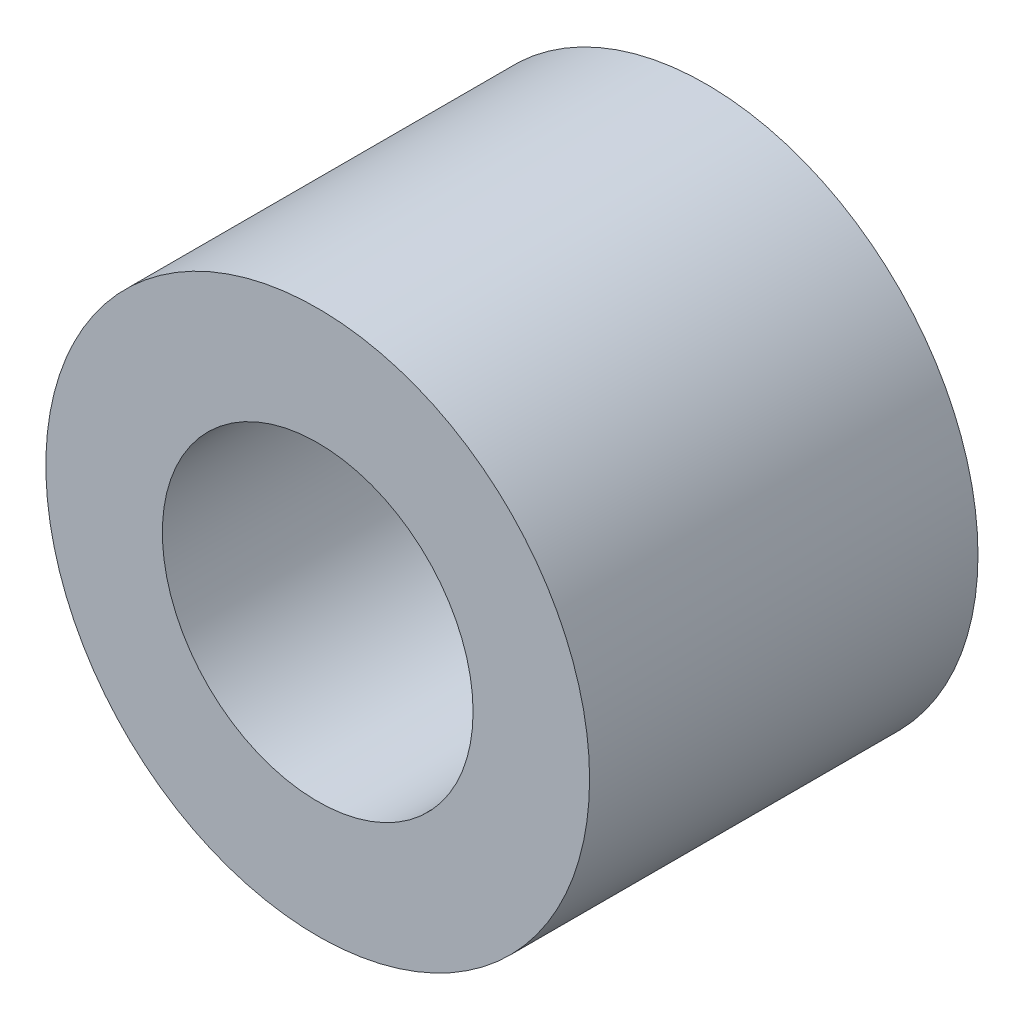
ISO-10303-21;
HEADER;
FILE_DESCRIPTION(('STEP AP214'),'2;1');
FILE_NAME('part.step','',(''),(''),'','','');
FILE_SCHEMA(('AUTOMOTIVE_DESIGN { 1 0 10303 214 1 1 1 1 }'));
ENDSEC;
DATA;
#1=APPLICATION_CONTEXT('core data for automotive mechanical design processes');
#2=APPLICATION_PROTOCOL_DEFINITION('international standard','automotive_design',2000,#1);
#3=PRODUCT_CONTEXT('',#1,'mechanical');
#4=PRODUCT('Part','Part','',(#3));
#5=PRODUCT_RELATED_PRODUCT_CATEGORY('part','',(#4));
#6=PRODUCT_DEFINITION_FORMATION('','',#4);
#7=PRODUCT_DEFINITION_CONTEXT('part definition',#1,'design');
#8=PRODUCT_DEFINITION('design','',#6,#7);
#9=PRODUCT_DEFINITION_SHAPE('','',#8);
#10=(LENGTH_UNIT() NAMED_UNIT(*) SI_UNIT(.MILLI.,.METRE.));
#11=(NAMED_UNIT(*) PLANE_ANGLE_UNIT() SI_UNIT($,.RADIAN.));
#12=(NAMED_UNIT(*) SI_UNIT($,.STERADIAN.) SOLID_ANGLE_UNIT());
#13=UNCERTAINTY_MEASURE_WITH_UNIT(LENGTH_MEASURE(1.E-05),#10,'distance_accuracy_value','');
#14=(GEOMETRIC_REPRESENTATION_CONTEXT(3) GLOBAL_UNCERTAINTY_ASSIGNED_CONTEXT((#13)) GLOBAL_UNIT_ASSIGNED_CONTEXT((#10,
#11,#12)) REPRESENTATION_CONTEXT('',''));
#15=CARTESIAN_POINT('',(0.,0.,0.));
#16=DIRECTION('',(0.,0.,1.));
#17=DIRECTION('',(1.,0.,0.));
#18=AXIS2_PLACEMENT_3D('',#15,#16,#17);
#19=CARTESIAN_POINT('',(0.,0.,5.));
#20=DIRECTION('',(0.,0.,1.));
#21=DIRECTION('',(1.,0.,0.));
#22=AXIS2_PLACEMENT_3D('',#19,#20,#21);
#23=PLANE('',#22);
#24=CARTESIAN_POINT('',(0.,0.,5.));
#25=DIRECTION('',(0.,0.,1.));
#26=DIRECTION('',(1.,0.,0.));
#27=AXIS2_PLACEMENT_3D('',#24,#25,#26);
#28=CIRCLE('',#27,3.5);
#29=CARTESIAN_POINT('',(3.5,0.,5.));
#30=VERTEX_POINT('',#29);
#31=EDGE_CURVE('E10',#30,#30,#28,.T.);
#32=ORIENTED_EDGE('',*,*,#31,.T.);
#33=EDGE_LOOP('',(#32));
#34=FACE_BOUND('',#33,.T.);
#35=CARTESIAN_POINT('',(0.,0.,5.));
#36=DIRECTION('',(0.,0.,1.));
#37=DIRECTION('',(1.,0.,0.));
#38=AXIS2_PLACEMENT_3D('',#35,#36,#37);
#39=CIRCLE('',#38,2.);
#40=CARTESIAN_POINT('',(2.,0.,5.));
#41=VERTEX_POINT('',#40);
#42=EDGE_CURVE('E43',#41,#41,#39,.T.);
#43=ORIENTED_EDGE('',*,*,#42,.F.);
#44=EDGE_LOOP('',(#43));
#45=FACE_BOUND('',#44,.T.);
#46=ADVANCED_FACE('F32',(#34,#45),#23,.T.);
#47=CARTESIAN_POINT('',(0.,0.,0.));
#48=DIRECTION('',(0.,0.,1.));
#49=DIRECTION('',(1.,0.,0.));
#50=AXIS2_PLACEMENT_3D('',#47,#48,#49);
#51=PLANE('',#50);
#52=CARTESIAN_POINT('',(0.,0.,0.));
#53=DIRECTION('',(0.,0.,1.));
#54=DIRECTION('',(1.,0.,0.));
#55=AXIS2_PLACEMENT_3D('',#52,#53,#54);
#56=CIRCLE('',#55,3.5);
#57=CARTESIAN_POINT('',(3.5,0.,0.));
#58=VERTEX_POINT('',#57);
#59=EDGE_CURVE('E36',#58,#58,#56,.T.);
#60=ORIENTED_EDGE('',*,*,#59,.F.);
#61=EDGE_LOOP('',(#60));
#62=FACE_BOUND('',#61,.T.);
#63=CARTESIAN_POINT('',(0.,0.,0.));
#64=DIRECTION('',(0.,0.,1.));
#65=DIRECTION('',(1.,0.,0.));
#66=AXIS2_PLACEMENT_3D('',#63,#64,#65);
#67=CIRCLE('',#66,2.);
#68=CARTESIAN_POINT('',(2.,0.,0.));
#69=VERTEX_POINT('',#68);
#70=EDGE_CURVE('E45',#69,#69,#67,.T.);
#71=ORIENTED_EDGE('',*,*,#70,.T.);
#72=EDGE_LOOP('',(#71));
#73=FACE_BOUND('',#72,.T.);
#74=ADVANCED_FACE('F55',(#62,#73),#51,.F.);
#75=CARTESIAN_POINT('',(0.,0.,5.));
#76=DIRECTION('',(0.,0.,-1.));
#77=DIRECTION('',(-1.,0.,0.));
#78=AXIS2_PLACEMENT_3D('',#75,#76,#77);
#79=CYLINDRICAL_SURFACE('',#78,3.5);
#80=ORIENTED_EDGE('',*,*,#31,.F.);
#81=EDGE_LOOP('',(#80));
#82=FACE_BOUND('',#81,.T.);
#83=ORIENTED_EDGE('',*,*,#59,.T.);
#84=EDGE_LOOP('',(#83));
#85=FACE_BOUND('',#84,.T.);
#86=ADVANCED_FACE('F34',(#82,#85),#79,.T.);
#87=CARTESIAN_POINT('',(0.,0.,5.));
#88=DIRECTION('',(0.,0.,-1.));
#89=DIRECTION('',(-1.,0.,0.));
#90=AXIS2_PLACEMENT_3D('',#87,#88,#89);
#91=CYLINDRICAL_SURFACE('',#90,2.);
#92=ORIENTED_EDGE('',*,*,#42,.T.);
#93=EDGE_LOOP('',(#92));
#94=FACE_BOUND('',#93,.T.);
#95=ORIENTED_EDGE('',*,*,#70,.F.);
#96=EDGE_LOOP('',(#95));
#97=FACE_BOUND('',#96,.T.);
#98=ADVANCED_FACE('F51',(#94,#97),#91,.F.);
#99=CLOSED_SHELL('',(#46,#74,#86,#98));
#100=MANIFOLD_SOLID_BREP('B2',#99);
#101=ADVANCED_BREP_SHAPE_REPRESENTATION('',(#18,#100),#14);
#102=SHAPE_DEFINITION_REPRESENTATION(#9,#101);
ENDSEC;
END-ISO-10303-21;
